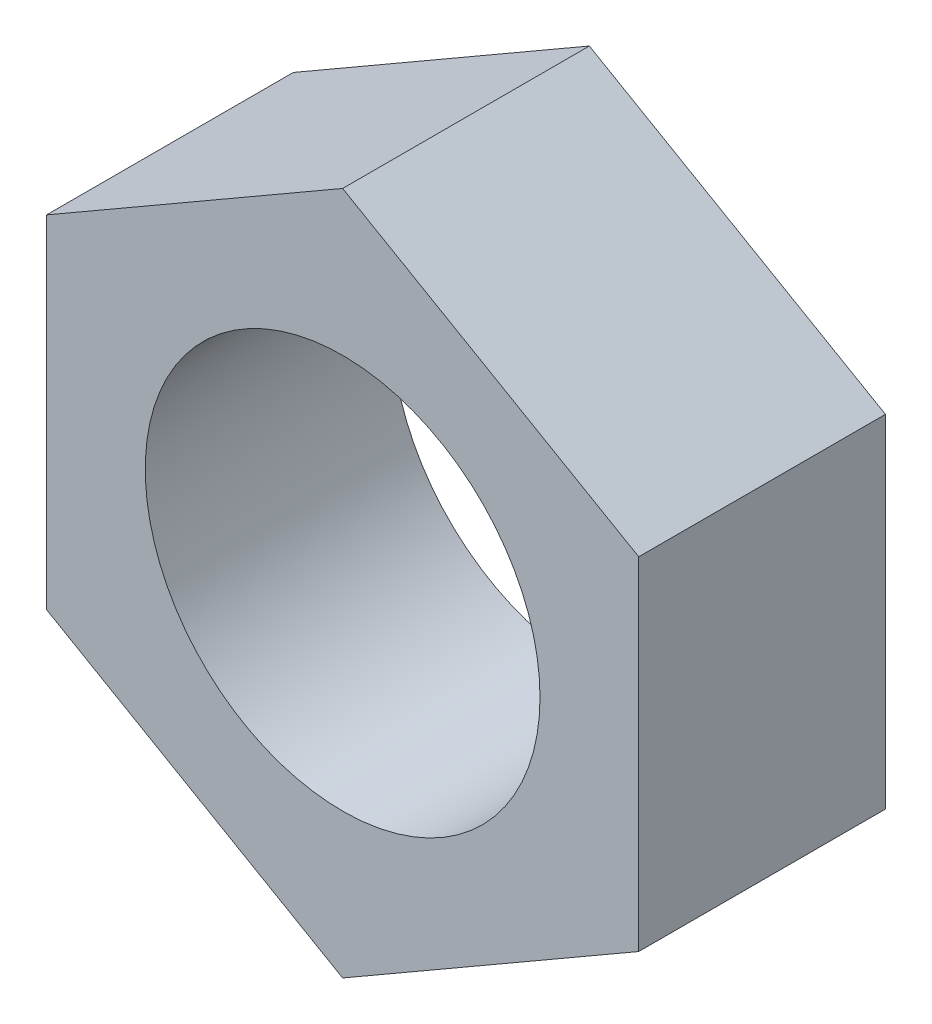
ISO-10303-21;
HEADER;
FILE_DESCRIPTION(('STEP AP214'),'2;1');
FILE_NAME('part.step','',(''),(''),'','','');
FILE_SCHEMA(('AUTOMOTIVE_DESIGN { 1 0 10303 214 1 1 1 1 }'));
ENDSEC;
DATA;
#1=APPLICATION_CONTEXT('core data for automotive mechanical design processes');
#2=APPLICATION_PROTOCOL_DEFINITION('international standard','automotive_design',2000,#1);
#3=PRODUCT_CONTEXT('',#1,'mechanical');
#4=PRODUCT('Part','Part','',(#3));
#5=PRODUCT_RELATED_PRODUCT_CATEGORY('part','',(#4));
#6=PRODUCT_DEFINITION_FORMATION('','',#4);
#7=PRODUCT_DEFINITION_CONTEXT('part definition',#1,'design');
#8=PRODUCT_DEFINITION('design','',#6,#7);
#9=PRODUCT_DEFINITION_SHAPE('','',#8);
#10=(LENGTH_UNIT() NAMED_UNIT(*) SI_UNIT(.MILLI.,.METRE.));
#11=(NAMED_UNIT(*) PLANE_ANGLE_UNIT() SI_UNIT($,.RADIAN.));
#12=(NAMED_UNIT(*) SI_UNIT($,.STERADIAN.) SOLID_ANGLE_UNIT());
#13=UNCERTAINTY_MEASURE_WITH_UNIT(LENGTH_MEASURE(1.E-05),#10,'distance_accuracy_value','');
#14=(GEOMETRIC_REPRESENTATION_CONTEXT(3) GLOBAL_UNCERTAINTY_ASSIGNED_CONTEXT((#13)) GLOBAL_UNIT_ASSIGNED_CONTEXT((#10,
#11,#12)) REPRESENTATION_CONTEXT('',''));
#15=CARTESIAN_POINT('',(0.,0.,0.));
#16=DIRECTION('',(0.,0.,1.));
#17=DIRECTION('',(1.,0.,0.));
#18=AXIS2_PLACEMENT_3D('',#15,#16,#17);
#19=CARTESIAN_POINT('',(-19.05,0.,7.9375));
#20=DIRECTION('',(0.,0.,1.));
#21=DIRECTION('',(1.,0.,0.));
#22=AXIS2_PLACEMENT_3D('',#19,#20,#21);
#23=PLANE('',#22);
#24=DIRECTION('',(-0.866025403784439,-0.5,0.));
#25=VECTOR('',#24,1.);
#26=CARTESIAN_POINT('',(0.,10.9985226280624,7.9375));
#27=LINE('',#26,#25);
#28=CARTESIAN_POINT('',(0.,10.9985226280624,7.9375));
#29=VERTEX_POINT('',#28);
#30=CARTESIAN_POINT('',(-9.525,5.49926131403118,7.9375));
#31=VERTEX_POINT('',#30);
#32=EDGE_CURVE('E128',#29,#31,#27,.T.);
#33=ORIENTED_EDGE('',*,*,#32,.T.);
#34=DIRECTION('',(0.,-1.,0.));
#35=VECTOR('',#34,1.);
#36=CARTESIAN_POINT('',(-9.525,5.49926131403118,7.9375));
#37=LINE('',#36,#35);
#38=CARTESIAN_POINT('',(-9.52500000000001,-5.49926131403119,7.9375));
#39=VERTEX_POINT('',#38);
#40=EDGE_CURVE('E86',#31,#39,#37,.T.);
#41=ORIENTED_EDGE('',*,*,#40,.T.);
#42=DIRECTION('',(0.866025403784439,-0.5,0.));
#43=VECTOR('',#42,1.);
#44=CARTESIAN_POINT('',(-9.52500000000001,-5.49926131403119,7.9375));
#45=LINE('',#44,#43);
#46=CARTESIAN_POINT('',(0.,-10.9985226280624,7.9375));
#47=VERTEX_POINT('',#46);
#48=EDGE_CURVE('E99',#39,#47,#45,.T.);
#49=ORIENTED_EDGE('',*,*,#48,.T.);
#50=DIRECTION('',(0.866025403784439,0.5,0.));
#51=VECTOR('',#50,1.);
#52=CARTESIAN_POINT('',(0.,-10.9985226280624,7.9375));
#53=LINE('',#52,#51);
#54=CARTESIAN_POINT('',(9.525,-5.49926131403119,7.9375));
#55=VERTEX_POINT('',#54);
#56=EDGE_CURVE('E93',#47,#55,#53,.T.);
#57=ORIENTED_EDGE('',*,*,#56,.T.);
#58=DIRECTION('',(0.,1.,0.));
#59=VECTOR('',#58,1.);
#60=CARTESIAN_POINT('',(9.525,-5.49926131403119,7.9375));
#61=LINE('',#60,#59);
#62=CARTESIAN_POINT('',(9.525,5.49926131403119,7.9375));
#63=VERTEX_POINT('',#62);
#64=EDGE_CURVE('E97',#55,#63,#61,.T.);
#65=ORIENTED_EDGE('',*,*,#64,.T.);
#66=DIRECTION('',(-0.866025403784439,0.5,0.));
#67=VECTOR('',#66,1.);
#68=CARTESIAN_POINT('',(9.525,5.49926131403119,7.9375));
#69=LINE('',#68,#67);
#70=EDGE_CURVE('E49',#63,#29,#69,.T.);
#71=ORIENTED_EDGE('',*,*,#70,.T.);
#72=EDGE_LOOP('',(#33,#41,#49,#57,#65,#71));
#73=FACE_BOUND('',#72,.T.);
#74=CARTESIAN_POINT('',(0.,0.,7.9375));
#75=DIRECTION('',(0.,0.,1.));
#76=DIRECTION('',(1.,0.,0.));
#77=AXIS2_PLACEMENT_3D('',#74,#75,#76);
#78=CIRCLE('',#77,6.35);
#79=CARTESIAN_POINT('',(6.35,0.,7.9375));
#80=VERTEX_POINT('',#79);
#81=EDGE_CURVE('E121',#80,#80,#78,.T.);
#82=ORIENTED_EDGE('',*,*,#81,.F.);
#83=EDGE_LOOP('',(#82));
#84=FACE_BOUND('',#83,.T.);
#85=ADVANCED_FACE('F32',(#73,#84),#23,.T.);
#86=CARTESIAN_POINT('',(-19.05,0.,0.));
#87=DIRECTION('',(0.,0.,1.));
#88=DIRECTION('',(1.,0.,0.));
#89=AXIS2_PLACEMENT_3D('',#86,#87,#88);
#90=PLANE('',#89);
#91=DIRECTION('',(-0.866025403784439,-0.5,0.));
#92=VECTOR('',#91,1.);
#93=CARTESIAN_POINT('',(0.,10.9985226280624,0.));
#94=LINE('',#93,#92);
#95=CARTESIAN_POINT('',(0.,10.9985226280624,0.));
#96=VERTEX_POINT('',#95);
#97=CARTESIAN_POINT('',(-9.525,5.49926131403118,0.));
#98=VERTEX_POINT('',#97);
#99=EDGE_CURVE('E117',#96,#98,#94,.T.);
#100=ORIENTED_EDGE('',*,*,#99,.F.);
#101=DIRECTION('',(-0.866025403784439,0.5,0.));
#102=VECTOR('',#101,1.);
#103=CARTESIAN_POINT('',(9.525,5.49926131403119,0.));
#104=LINE('',#103,#102);
#105=CARTESIAN_POINT('',(9.525,5.49926131403119,0.));
#106=VERTEX_POINT('',#105);
#107=EDGE_CURVE('E78',#106,#96,#104,.T.);
#108=ORIENTED_EDGE('',*,*,#107,.F.);
#109=DIRECTION('',(0.,1.,0.));
#110=VECTOR('',#109,1.);
#111=CARTESIAN_POINT('',(9.525,-5.49926131403119,0.));
#112=LINE('',#111,#110);
#113=CARTESIAN_POINT('',(9.525,-5.49926131403119,0.));
#114=VERTEX_POINT('',#113);
#115=EDGE_CURVE('E72',#114,#106,#112,.T.);
#116=ORIENTED_EDGE('',*,*,#115,.F.);
#117=DIRECTION('',(0.866025403784439,0.5,0.));
#118=VECTOR('',#117,1.);
#119=CARTESIAN_POINT('',(0.,-10.9985226280624,0.));
#120=LINE('',#119,#118);
#121=CARTESIAN_POINT('',(0.,-10.9985226280624,0.));
#122=VERTEX_POINT('',#121);
#123=EDGE_CURVE('E107',#122,#114,#120,.T.);
#124=ORIENTED_EDGE('',*,*,#123,.F.);
#125=DIRECTION('',(0.866025403784439,-0.5,0.));
#126=VECTOR('',#125,1.);
#127=CARTESIAN_POINT('',(-9.52500000000001,-5.49926131403119,0.));
#128=LINE('',#127,#126);
#129=CARTESIAN_POINT('',(-9.52500000000001,-5.49926131403119,0.));
#130=VERTEX_POINT('',#129);
#131=EDGE_CURVE('E123',#130,#122,#128,.T.);
#132=ORIENTED_EDGE('',*,*,#131,.F.);
#133=DIRECTION('',(0.,-1.,0.));
#134=VECTOR('',#133,1.);
#135=CARTESIAN_POINT('',(-9.525,5.49926131403118,0.));
#136=LINE('',#135,#134);
#137=EDGE_CURVE('E120',#98,#130,#136,.T.);
#138=ORIENTED_EDGE('',*,*,#137,.F.);
#139=EDGE_LOOP('',(#100,#108,#116,#124,#132,#138));
#140=FACE_BOUND('',#139,.T.);
#141=CARTESIAN_POINT('',(0.,0.,0.));
#142=DIRECTION('',(0.,0.,1.));
#143=DIRECTION('',(1.,0.,0.));
#144=AXIS2_PLACEMENT_3D('',#141,#142,#143);
#145=CIRCLE('',#144,6.35);
#146=CARTESIAN_POINT('',(6.35,0.,0.));
#147=VERTEX_POINT('',#146);
#148=EDGE_CURVE('E221',#147,#147,#145,.T.);
#149=ORIENTED_EDGE('',*,*,#148,.T.);
#150=EDGE_LOOP('',(#149));
#151=FACE_BOUND('',#150,.T.);
#152=ADVANCED_FACE('F137',(#140,#151),#90,.F.);
#153=CARTESIAN_POINT('',(0.,10.9985226280624,7.9375));
#154=DIRECTION('',(0.5,-0.866025403784439,0.));
#155=DIRECTION('',(0.866025403784439,0.5,0.));
#156=AXIS2_PLACEMENT_3D('',#153,#154,#155);
#157=PLANE('',#156);
#158=ORIENTED_EDGE('',*,*,#99,.T.);
#159=DIRECTION('',(0.,0.,-1.));
#160=VECTOR('',#159,1.);
#161=CARTESIAN_POINT('',(-9.525,5.49926131403118,7.9375));
#162=LINE('',#161,#160);
#163=EDGE_CURVE('E11',#31,#98,#162,.T.);
#164=ORIENTED_EDGE('',*,*,#163,.F.);
#165=ORIENTED_EDGE('',*,*,#32,.F.);
#166=DIRECTION('',(0.,0.,-1.));
#167=VECTOR('',#166,1.);
#168=CARTESIAN_POINT('',(0.,10.9985226280624,7.9375));
#169=LINE('',#168,#167);
#170=EDGE_CURVE('E113',#29,#96,#169,.T.);
#171=ORIENTED_EDGE('',*,*,#170,.T.);
#172=EDGE_LOOP('',(#158,#164,#165,#171));
#173=FACE_BOUND('',#172,.T.);
#174=ADVANCED_FACE('F34',(#173),#157,.F.);
#175=CARTESIAN_POINT('',(-9.525,5.49926131403118,7.9375));
#176=DIRECTION('',(1.,0.,0.));
#177=DIRECTION('',(0.,1.,0.));
#178=AXIS2_PLACEMENT_3D('',#175,#176,#177);
#179=PLANE('',#178);
#180=ORIENTED_EDGE('',*,*,#137,.T.);
#181=DIRECTION('',(0.,0.,-1.));
#182=VECTOR('',#181,1.);
#183=CARTESIAN_POINT('',(-9.52500000000001,-5.49926131403119,7.9375));
#184=LINE('',#183,#182);
#185=EDGE_CURVE('E41',#39,#130,#184,.T.);
#186=ORIENTED_EDGE('',*,*,#185,.F.);
#187=ORIENTED_EDGE('',*,*,#40,.F.);
#188=ORIENTED_EDGE('',*,*,#163,.T.);
#189=EDGE_LOOP('',(#180,#186,#187,#188));
#190=FACE_BOUND('',#189,.T.);
#191=ADVANCED_FACE('F162',(#190),#179,.F.);
#192=CARTESIAN_POINT('',(-9.52500000000001,-5.49926131403119,7.9375));
#193=DIRECTION('',(0.5,0.866025403784439,0.));
#194=DIRECTION('',(-0.866025403784439,0.5,0.));
#195=AXIS2_PLACEMENT_3D('',#192,#193,#194);
#196=PLANE('',#195);
#197=ORIENTED_EDGE('',*,*,#131,.T.);
#198=DIRECTION('',(0.,0.,-1.));
#199=VECTOR('',#198,1.);
#200=CARTESIAN_POINT('',(0.,-10.9985226280624,7.9375));
#201=LINE('',#200,#199);
#202=EDGE_CURVE('E108',#47,#122,#201,.T.);
#203=ORIENTED_EDGE('',*,*,#202,.F.);
#204=ORIENTED_EDGE('',*,*,#48,.F.);
#205=ORIENTED_EDGE('',*,*,#185,.T.);
#206=EDGE_LOOP('',(#197,#203,#204,#205));
#207=FACE_BOUND('',#206,.T.);
#208=ADVANCED_FACE('F134',(#207),#196,.F.);
#209=CARTESIAN_POINT('',(0.,-10.9985226280624,7.9375));
#210=DIRECTION('',(-0.5,0.866025403784439,0.));
#211=DIRECTION('',(-0.866025403784439,-0.5,0.));
#212=AXIS2_PLACEMENT_3D('',#209,#210,#211);
#213=PLANE('',#212);
#214=ORIENTED_EDGE('',*,*,#123,.T.);
#215=DIRECTION('',(0.,0.,-1.));
#216=VECTOR('',#215,1.);
#217=CARTESIAN_POINT('',(9.525,-5.49926131403119,7.9375));
#218=LINE('',#217,#216);
#219=EDGE_CURVE('E104',#55,#114,#218,.T.);
#220=ORIENTED_EDGE('',*,*,#219,.F.);
#221=ORIENTED_EDGE('',*,*,#56,.F.);
#222=ORIENTED_EDGE('',*,*,#202,.T.);
#223=EDGE_LOOP('',(#214,#220,#221,#222));
#224=FACE_BOUND('',#223,.T.);
#225=ADVANCED_FACE('F105',(#224),#213,.F.);
#226=CARTESIAN_POINT('',(9.525,-5.49926131403119,7.9375));
#227=DIRECTION('',(-1.,0.,0.));
#228=DIRECTION('',(0.,0.,1.));
#229=AXIS2_PLACEMENT_3D('',#226,#227,#228);
#230=PLANE('',#229);
#231=ORIENTED_EDGE('',*,*,#115,.T.);
#232=DIRECTION('',(0.,0.,-1.));
#233=VECTOR('',#232,1.);
#234=CARTESIAN_POINT('',(9.525,5.49926131403119,7.9375));
#235=LINE('',#234,#233);
#236=EDGE_CURVE('E109',#63,#106,#235,.T.);
#237=ORIENTED_EDGE('',*,*,#236,.F.);
#238=ORIENTED_EDGE('',*,*,#64,.F.);
#239=ORIENTED_EDGE('',*,*,#219,.T.);
#240=EDGE_LOOP('',(#231,#237,#238,#239));
#241=FACE_BOUND('',#240,.T.);
#242=ADVANCED_FACE('F111',(#241),#230,.F.);
#243=CARTESIAN_POINT('',(9.525,5.49926131403119,7.9375));
#244=DIRECTION('',(-0.5,-0.866025403784439,0.));
#245=DIRECTION('',(0.866025403784439,-0.5,0.));
#246=AXIS2_PLACEMENT_3D('',#243,#244,#245);
#247=PLANE('',#246);
#248=ORIENTED_EDGE('',*,*,#107,.T.);
#249=ORIENTED_EDGE('',*,*,#170,.F.);
#250=ORIENTED_EDGE('',*,*,#70,.F.);
#251=ORIENTED_EDGE('',*,*,#236,.T.);
#252=EDGE_LOOP('',(#248,#249,#250,#251));
#253=FACE_BOUND('',#252,.T.);
#254=ADVANCED_FACE('F142',(#253),#247,.F.);
#255=CARTESIAN_POINT('',(0.,0.,7.9375));
#256=DIRECTION('',(0.,0.,-1.));
#257=DIRECTION('',(-1.,0.,0.));
#258=AXIS2_PLACEMENT_3D('',#255,#256,#257);
#259=CYLINDRICAL_SURFACE('',#258,6.35);
#260=ORIENTED_EDGE('',*,*,#81,.T.);
#261=EDGE_LOOP('',(#260));
#262=FACE_BOUND('',#261,.T.);
#263=ORIENTED_EDGE('',*,*,#148,.F.);
#264=EDGE_LOOP('',(#263));
#265=FACE_BOUND('',#264,.T.);
#266=ADVANCED_FACE('F144',(#262,#265),#259,.F.);
#267=CLOSED_SHELL('',(#85,#152,#174,#191,#208,#225,#242,#254,#266));
#268=MANIFOLD_SOLID_BREP('B2',#267);
#269=ADVANCED_BREP_SHAPE_REPRESENTATION('',(#18,#268),#14);
#270=SHAPE_DEFINITION_REPRESENTATION(#9,#269);
ENDSEC;
END-ISO-10303-21;
